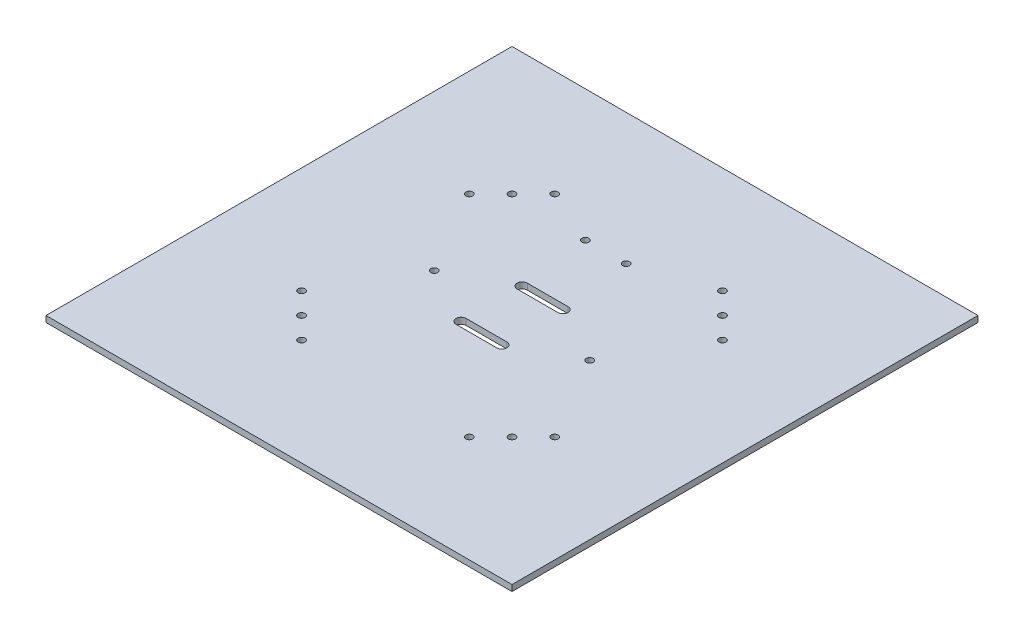
ISO-10303-21;
HEADER;
FILE_DESCRIPTION(('STEP AP214'),'2;1');
FILE_NAME('part.step','',(''),(''),'','','');
FILE_SCHEMA(('AUTOMOTIVE_DESIGN { 1 0 10303 214 1 1 1 1 }'));
ENDSEC;
DATA;
#1=APPLICATION_CONTEXT('core data for automotive mechanical design processes');
#2=APPLICATION_PROTOCOL_DEFINITION('international standard','automotive_design',2000,#1);
#3=PRODUCT_CONTEXT('',#1,'mechanical');
#4=PRODUCT('Part','Part','',(#3));
#5=PRODUCT_RELATED_PRODUCT_CATEGORY('part','',(#4));
#6=PRODUCT_DEFINITION_FORMATION('','',#4);
#7=PRODUCT_DEFINITION_CONTEXT('part definition',#1,'design');
#8=PRODUCT_DEFINITION('design','',#6,#7);
#9=PRODUCT_DEFINITION_SHAPE('','',#8);
#10=(LENGTH_UNIT() NAMED_UNIT(*) SI_UNIT(.MILLI.,.METRE.));
#11=(NAMED_UNIT(*) PLANE_ANGLE_UNIT() SI_UNIT($,.RADIAN.));
#12=(NAMED_UNIT(*) SI_UNIT($,.STERADIAN.) SOLID_ANGLE_UNIT());
#13=UNCERTAINTY_MEASURE_WITH_UNIT(LENGTH_MEASURE(1.E-05),#10,'distance_accuracy_value','');
#14=(GEOMETRIC_REPRESENTATION_CONTEXT(3) GLOBAL_UNCERTAINTY_ASSIGNED_CONTEXT((#13)) GLOBAL_UNIT_ASSIGNED_CONTEXT((#10,
#11,#12)) REPRESENTATION_CONTEXT('',''));
#15=CARTESIAN_POINT('',(0.,0.,0.));
#16=DIRECTION('',(0.,0.,1.));
#17=DIRECTION('',(1.,0.,0.));
#18=AXIS2_PLACEMENT_3D('',#15,#16,#17);
#19=CARTESIAN_POINT('',(114.3,3.,-114.3));
#20=DIRECTION('',(-1.,0.,0.));
#21=DIRECTION('',(0.,0.,1.));
#22=AXIS2_PLACEMENT_3D('',#19,#20,#21);
#23=PLANE('',#22);
#24=DIRECTION('',(0.,0.,-1.));
#25=VECTOR('',#24,1.);
#26=CARTESIAN_POINT('',(114.3,0.,-114.3));
#27=LINE('',#26,#25);
#28=CARTESIAN_POINT('',(114.3,0.,114.3));
#29=VERTEX_POINT('',#28);
#30=CARTESIAN_POINT('',(114.3,0.,-114.3));
#31=VERTEX_POINT('',#30);
#32=EDGE_CURVE('E283',#29,#31,#27,.T.);
#33=ORIENTED_EDGE('',*,*,#32,.T.);
#34=DIRECTION('',(0.,-1.,0.));
#35=VECTOR('',#34,1.);
#36=CARTESIAN_POINT('',(114.3,3.,-114.3));
#37=LINE('',#36,#35);
#38=CARTESIAN_POINT('',(114.3,3.,-114.3));
#39=VERTEX_POINT('',#38);
#40=EDGE_CURVE('E11',#39,#31,#37,.T.);
#41=ORIENTED_EDGE('',*,*,#40,.F.);
#42=DIRECTION('',(0.,0.,-1.));
#43=VECTOR('',#42,1.);
#44=CARTESIAN_POINT('',(114.3,3.,-114.3));
#45=LINE('',#44,#43);
#46=CARTESIAN_POINT('',(114.3,3.,114.3));
#47=VERTEX_POINT('',#46);
#48=EDGE_CURVE('E286',#47,#39,#45,.T.);
#49=ORIENTED_EDGE('',*,*,#48,.F.);
#50=DIRECTION('',(0.,-1.,0.));
#51=VECTOR('',#50,1.);
#52=CARTESIAN_POINT('',(114.3,3.,114.3));
#53=LINE('',#52,#51);
#54=EDGE_CURVE('E296',#47,#29,#53,.T.);
#55=ORIENTED_EDGE('',*,*,#54,.T.);
#56=EDGE_LOOP('',(#33,#41,#49,#55));
#57=FACE_BOUND('',#56,.T.);
#58=ADVANCED_FACE('F33',(#57),#23,.F.);
#59=CARTESIAN_POINT('',(-114.3,3.,-114.3));
#60=DIRECTION('',(0.,0.,1.));
#61=DIRECTION('',(1.,0.,0.));
#62=AXIS2_PLACEMENT_3D('',#59,#60,#61);
#63=PLANE('',#62);
#64=DIRECTION('',(-1.,0.,0.));
#65=VECTOR('',#64,1.);
#66=CARTESIAN_POINT('',(-114.3,0.,-114.3));
#67=LINE('',#66,#65);
#68=CARTESIAN_POINT('',(-114.3,0.,-114.3));
#69=VERTEX_POINT('',#68);
#70=EDGE_CURVE('E299',#31,#69,#67,.T.);
#71=ORIENTED_EDGE('',*,*,#70,.T.);
#72=DIRECTION('',(0.,-1.,0.));
#73=VECTOR('',#72,1.);
#74=CARTESIAN_POINT('',(-114.3,3.,-114.3));
#75=LINE('',#74,#73);
#76=CARTESIAN_POINT('',(-114.3,3.,-114.3));
#77=VERTEX_POINT('',#76);
#78=EDGE_CURVE('E40',#77,#69,#75,.T.);
#79=ORIENTED_EDGE('',*,*,#78,.F.);
#80=DIRECTION('',(-1.,0.,0.));
#81=VECTOR('',#80,1.);
#82=CARTESIAN_POINT('',(-114.3,3.,-114.3));
#83=LINE('',#82,#81);
#84=EDGE_CURVE('E289',#39,#77,#83,.T.);
#85=ORIENTED_EDGE('',*,*,#84,.F.);
#86=ORIENTED_EDGE('',*,*,#40,.T.);
#87=EDGE_LOOP('',(#71,#79,#85,#86));
#88=FACE_BOUND('',#87,.T.);
#89=ADVANCED_FACE('F328',(#88),#63,.F.);
#90=CARTESIAN_POINT('',(-114.3,3.,-114.3));
#91=DIRECTION('',(1.,0.,0.));
#92=DIRECTION('',(0.,0.,-1.));
#93=AXIS2_PLACEMENT_3D('',#90,#91,#92);
#94=PLANE('',#93);
#95=DIRECTION('',(0.,0.,1.));
#96=VECTOR('',#95,1.);
#97=CARTESIAN_POINT('',(-114.3,0.,-114.3));
#98=LINE('',#97,#96);
#99=CARTESIAN_POINT('',(-114.3,0.,114.3));
#100=VERTEX_POINT('',#99);
#101=EDGE_CURVE('E301',#69,#100,#98,.T.);
#102=ORIENTED_EDGE('',*,*,#101,.T.);
#103=DIRECTION('',(0.,-1.,0.));
#104=VECTOR('',#103,1.);
#105=CARTESIAN_POINT('',(-114.3,3.,114.3));
#106=LINE('',#105,#104);
#107=CARTESIAN_POINT('',(-114.3,3.,114.3));
#108=VERTEX_POINT('',#107);
#109=EDGE_CURVE('E306',#108,#100,#106,.T.);
#110=ORIENTED_EDGE('',*,*,#109,.F.);
#111=DIRECTION('',(0.,0.,1.));
#112=VECTOR('',#111,1.);
#113=CARTESIAN_POINT('',(-114.3,3.,-114.3));
#114=LINE('',#113,#112);
#115=EDGE_CURVE('E292',#77,#108,#114,.T.);
#116=ORIENTED_EDGE('',*,*,#115,.F.);
#117=ORIENTED_EDGE('',*,*,#78,.T.);
#118=EDGE_LOOP('',(#102,#110,#116,#117));
#119=FACE_BOUND('',#118,.T.);
#120=ADVANCED_FACE('F313',(#119),#94,.F.);
#121=CARTESIAN_POINT('',(-114.3,3.,114.3));
#122=DIRECTION('',(0.,0.,-1.));
#123=DIRECTION('',(-1.,0.,0.));
#124=AXIS2_PLACEMENT_3D('',#121,#122,#123);
#125=PLANE('',#124);
#126=DIRECTION('',(1.,0.,0.));
#127=VECTOR('',#126,1.);
#128=CARTESIAN_POINT('',(-114.3,0.,114.3));
#129=LINE('',#128,#127);
#130=EDGE_CURVE('E290',#100,#29,#129,.T.);
#131=ORIENTED_EDGE('',*,*,#130,.T.);
#132=ORIENTED_EDGE('',*,*,#54,.F.);
#133=DIRECTION('',(1.,0.,0.));
#134=VECTOR('',#133,1.);
#135=CARTESIAN_POINT('',(-114.3,3.,114.3));
#136=LINE('',#135,#134);
#137=EDGE_CURVE('E294',#108,#47,#136,.T.);
#138=ORIENTED_EDGE('',*,*,#137,.F.);
#139=ORIENTED_EDGE('',*,*,#109,.T.);
#140=EDGE_LOOP('',(#131,#132,#138,#139));
#141=FACE_BOUND('',#140,.T.);
#142=ADVANCED_FACE('F321',(#141),#125,.F.);
#143=CARTESIAN_POINT('',(0.,3.,0.));
#144=DIRECTION('',(0.,1.,0.));
#145=DIRECTION('',(0.,0.,1.));
#146=AXIS2_PLACEMENT_3D('',#143,#144,#145);
#147=PLANE('',#146);
#148=CARTESIAN_POINT('',(-9.99999999999999,3.,-15.));
#149=DIRECTION('',(0.,1.,0.));
#150=DIRECTION('',(0.,0.,1.));
#151=AXIS2_PLACEMENT_3D('',#148,#149,#150);
#152=CIRCLE('',#151,2.5);
#153=CARTESIAN_POINT('',(-9.99999999999999,3.,-17.5));
#154=VERTEX_POINT('',#153);
#155=CARTESIAN_POINT('',(-9.99999999999999,3.,-12.5));
#156=VERTEX_POINT('',#155);
#157=EDGE_CURVE('E47',#154,#156,#152,.T.);
#158=ORIENTED_EDGE('',*,*,#157,.F.);
#159=DIRECTION('',(-1.,0.,0.));
#160=VECTOR('',#159,1.);
#161=CARTESIAN_POINT('',(-9.99999999999999,3.,-17.5));
#162=LINE('',#161,#160);
#163=CARTESIAN_POINT('',(10.,3.,-17.5));
#164=VERTEX_POINT('',#163);
#165=EDGE_CURVE('E129',#164,#154,#162,.T.);
#166=ORIENTED_EDGE('',*,*,#165,.F.);
#167=CARTESIAN_POINT('',(10.,3.,-15.));
#168=DIRECTION('',(0.,1.,0.));
#169=DIRECTION('',(0.,0.,1.));
#170=AXIS2_PLACEMENT_3D('',#167,#168,#169);
#171=CIRCLE('',#170,2.5);
#172=CARTESIAN_POINT('',(10.,3.,-12.5));
#173=VERTEX_POINT('',#172);
#174=EDGE_CURVE('E152',#173,#164,#171,.T.);
#175=ORIENTED_EDGE('',*,*,#174,.F.);
#176=DIRECTION('',(1.,0.,0.));
#177=VECTOR('',#176,1.);
#178=CARTESIAN_POINT('',(-9.99999999999999,3.,-12.5));
#179=LINE('',#178,#177);
#180=EDGE_CURVE('E145',#156,#173,#179,.T.);
#181=ORIENTED_EDGE('',*,*,#180,.F.);
#182=EDGE_LOOP('',(#158,#166,#175,#181));
#183=FACE_BOUND('',#182,.T.);
#184=CARTESIAN_POINT('',(-10.,3.,15.));
#185=DIRECTION('',(0.,1.,0.));
#186=DIRECTION('',(0.,0.,1.));
#187=AXIS2_PLACEMENT_3D('',#184,#185,#186);
#188=CIRCLE('',#187,2.5);
#189=CARTESIAN_POINT('',(-9.99999999999998,3.,12.5));
#190=VERTEX_POINT('',#189);
#191=CARTESIAN_POINT('',(-9.99999999999998,3.,17.5));
#192=VERTEX_POINT('',#191);
#193=EDGE_CURVE('E55',#190,#192,#188,.T.);
#194=ORIENTED_EDGE('',*,*,#193,.F.);
#195=DIRECTION('',(-1.,0.,0.));
#196=VECTOR('',#195,1.);
#197=CARTESIAN_POINT('',(-9.99999999999998,3.,12.5));
#198=LINE('',#197,#196);
#199=CARTESIAN_POINT('',(10.,3.,12.5));
#200=VERTEX_POINT('',#199);
#201=EDGE_CURVE('E176',#200,#190,#198,.T.);
#202=ORIENTED_EDGE('',*,*,#201,.F.);
#203=CARTESIAN_POINT('',(10.,3.,15.));
#204=DIRECTION('',(0.,1.,0.));
#205=DIRECTION('',(0.,0.,1.));
#206=AXIS2_PLACEMENT_3D('',#203,#204,#205);
#207=CIRCLE('',#206,2.5);
#208=CARTESIAN_POINT('',(10.,3.,17.5));
#209=VERTEX_POINT('',#208);
#210=EDGE_CURVE('E173',#209,#200,#207,.T.);
#211=ORIENTED_EDGE('',*,*,#210,.F.);
#212=DIRECTION('',(1.,0.,0.));
#213=VECTOR('',#212,1.);
#214=CARTESIAN_POINT('',(-9.99999999999998,3.,17.5));
#215=LINE('',#214,#213);
#216=EDGE_CURVE('E170',#192,#209,#215,.T.);
#217=ORIENTED_EDGE('',*,*,#216,.F.);
#218=EDGE_LOOP('',(#194,#202,#211,#217));
#219=FACE_BOUND('',#218,.T.);
#220=CARTESIAN_POINT('',(-14.,3.,-50.));
#221=DIRECTION('',(0.,1.,0.));
#222=DIRECTION('',(0.,0.,1.));
#223=AXIS2_PLACEMENT_3D('',#220,#221,#222);
#224=CIRCLE('',#223,1.7);
#225=CARTESIAN_POINT('',(-14.,3.,-48.3));
#226=VERTEX_POINT('',#225);
#227=EDGE_CURVE('E190',#226,#226,#224,.T.);
#228=ORIENTED_EDGE('',*,*,#227,.F.);
#229=EDGE_LOOP('',(#228));
#230=FACE_BOUND('',#229,.T.);
#231=CARTESIAN_POINT('',(5.99999999999998,3.,-50.));
#232=DIRECTION('',(0.,1.,0.));
#233=DIRECTION('',(0.,0.,1.));
#234=AXIS2_PLACEMENT_3D('',#231,#232,#233);
#235=CIRCLE('',#234,1.7);
#236=CARTESIAN_POINT('',(5.99999999999998,3.,-48.3));
#237=VERTEX_POINT('',#236);
#238=EDGE_CURVE('E137',#237,#237,#235,.T.);
#239=ORIENTED_EDGE('',*,*,#238,.F.);
#240=EDGE_LOOP('',(#239));
#241=FACE_BOUND('',#240,.T.);
#242=CARTESIAN_POINT('',(-38.13,3.,0.));
#243=DIRECTION('',(0.,1.,0.));
#244=DIRECTION('',(0.,0.,1.));
#245=AXIS2_PLACEMENT_3D('',#242,#243,#244);
#246=CIRCLE('',#245,1.7);
#247=CARTESIAN_POINT('',(-38.13,3.,1.7));
#248=VERTEX_POINT('',#247);
#249=EDGE_CURVE('E206',#248,#248,#246,.T.);
#250=ORIENTED_EDGE('',*,*,#249,.F.);
#251=EDGE_LOOP('',(#250));
#252=FACE_BOUND('',#251,.T.);
#253=CARTESIAN_POINT('',(38.13,3.,0.));
#254=DIRECTION('',(0.,1.,0.));
#255=DIRECTION('',(0.,0.,1.));
#256=AXIS2_PLACEMENT_3D('',#253,#254,#255);
#257=CIRCLE('',#256,1.7);
#258=CARTESIAN_POINT('',(38.13,3.,1.7));
#259=VERTEX_POINT('',#258);
#260=EDGE_CURVE('E197',#259,#259,#257,.T.);
#261=ORIENTED_EDGE('',*,*,#260,.F.);
#262=EDGE_LOOP('',(#261));
#263=FACE_BOUND('',#262,.T.);
#264=CARTESIAN_POINT('',(62.0839753881918,3.,41.153614665057));
#265=DIRECTION('',(0.,1.,0.));
#266=DIRECTION('',(0.,0.,1.));
#267=AXIS2_PLACEMENT_3D('',#264,#265,#266);
#268=CIRCLE('',#267,1.6999999999964);
#269=CARTESIAN_POINT('',(62.0839753881918,3.,42.8536146650534));
#270=VERTEX_POINT('',#269);
#271=EDGE_CURVE('E248',#270,#270,#268,.T.);
#272=ORIENTED_EDGE('',*,*,#271,.F.);
#273=EDGE_LOOP('',(#272));
#274=FACE_BOUND('',#273,.T.);
#275=CARTESIAN_POINT('',(-51.6187950266051,3.,51.6187950266308));
#276=DIRECTION('',(0.,1.,0.));
#277=DIRECTION('',(0.,0.,1.));
#278=AXIS2_PLACEMENT_3D('',#275,#276,#277);
#279=CIRCLE('',#278,1.70000000000878);
#280=CARTESIAN_POINT('',(-51.6187950266051,3.,53.3187950266396));
#281=VERTEX_POINT('',#280);
#282=EDGE_CURVE('E235',#281,#281,#279,.T.);
#283=ORIENTED_EDGE('',*,*,#282,.F.);
#284=EDGE_LOOP('',(#283));
#285=FACE_BOUND('',#284,.T.);
#286=CARTESIAN_POINT('',(-62.083975388166,3.,41.15361466507));
#287=DIRECTION('',(0.,1.,0.));
#288=DIRECTION('',(0.,0.,1.));
#289=AXIS2_PLACEMENT_3D('',#286,#287,#288);
#290=CIRCLE('',#289,1.70000000000869);
#291=CARTESIAN_POINT('',(-62.083975388166,3.,42.8536146650786));
#292=VERTEX_POINT('',#291);
#293=EDGE_CURVE('E236',#292,#292,#290,.T.);
#294=ORIENTED_EDGE('',*,*,#293,.F.);
#295=EDGE_LOOP('',(#294));
#296=FACE_BOUND('',#295,.T.);
#297=CARTESIAN_POINT('',(-41.1536146650442,3.,62.0839753881918));
#298=DIRECTION('',(0.,1.,0.));
#299=DIRECTION('',(0.,0.,1.));
#300=AXIS2_PLACEMENT_3D('',#297,#298,#299);
#301=CIRCLE('',#300,1.70000000000886);
#302=CARTESIAN_POINT('',(-41.1536146650442,3.,63.7839753882006));
#303=VERTEX_POINT('',#302);
#304=EDGE_CURVE('E217',#303,#303,#301,.T.);
#305=ORIENTED_EDGE('',*,*,#304,.F.);
#306=EDGE_LOOP('',(#305));
#307=FACE_BOUND('',#306,.T.);
#308=CARTESIAN_POINT('',(41.15361466507,3.,62.0839753881789));
#309=DIRECTION('',(0.,1.,0.));
#310=DIRECTION('',(0.,0.,1.));
#311=AXIS2_PLACEMENT_3D('',#308,#309,#310);
#312=CIRCLE('',#311,1.69999999999631);
#313=CARTESIAN_POINT('',(41.15361466507,3.,63.7839753881752));
#314=VERTEX_POINT('',#313);
#315=EDGE_CURVE('E247',#314,#314,#312,.T.);
#316=ORIENTED_EDGE('',*,*,#315,.F.);
#317=EDGE_LOOP('',(#316));
#318=FACE_BOUND('',#317,.T.);
#319=CARTESIAN_POINT('',(51.6187950266309,3.,51.618795026618));
#320=DIRECTION('',(0.,1.,0.));
#321=DIRECTION('',(0.,0.,1.));
#322=AXIS2_PLACEMENT_3D('',#319,#320,#321);
#323=CIRCLE('',#322,1.69999999999636);
#324=CARTESIAN_POINT('',(51.6187950266309,3.,53.3187950266143));
#325=VERTEX_POINT('',#324);
#326=EDGE_CURVE('E272',#325,#325,#323,.T.);
#327=ORIENTED_EDGE('',*,*,#326,.F.);
#328=EDGE_LOOP('',(#327));
#329=FACE_BOUND('',#328,.T.);
#330=CARTESIAN_POINT('',(41.153614665057,3.,-62.0839753881789));
#331=DIRECTION('',(0.,1.,0.));
#332=DIRECTION('',(0.,0.,1.));
#333=AXIS2_PLACEMENT_3D('',#330,#331,#332);
#334=CIRCLE('',#333,1.7);
#335=CARTESIAN_POINT('',(41.153614665057,3.,-60.3839753881789));
#336=VERTEX_POINT('',#335);
#337=EDGE_CURVE('E266',#336,#336,#334,.T.);
#338=ORIENTED_EDGE('',*,*,#337,.F.);
#339=EDGE_LOOP('',(#338));
#340=FACE_BOUND('',#339,.T.);
#341=CARTESIAN_POINT('',(62.0839753881788,3.,-41.1536146650571));
#342=DIRECTION('',(0.,1.,0.));
#343=DIRECTION('',(0.,0.,1.));
#344=AXIS2_PLACEMENT_3D('',#341,#342,#343);
#345=CIRCLE('',#344,1.70000000000001);
#346=CARTESIAN_POINT('',(62.0839753881788,3.,-39.4536146650571));
#347=VERTEX_POINT('',#346);
#348=EDGE_CURVE('E260',#347,#347,#345,.T.);
#349=ORIENTED_EDGE('',*,*,#348,.F.);
#350=EDGE_LOOP('',(#349));
#351=FACE_BOUND('',#350,.T.);
#352=CARTESIAN_POINT('',(-51.618795026618,3.,-51.6187950266051));
#353=DIRECTION('',(0.,1.,0.));
#354=DIRECTION('',(0.,0.,1.));
#355=AXIS2_PLACEMENT_3D('',#352,#353,#354);
#356=CIRCLE('',#355,1.70000000001266);
#357=CARTESIAN_POINT('',(-51.618795026618,3.,-49.9187950265924));
#358=VERTEX_POINT('',#357);
#359=EDGE_CURVE('E218',#358,#358,#356,.T.);
#360=ORIENTED_EDGE('',*,*,#359,.F.);
#361=EDGE_LOOP('',(#360));
#362=FACE_BOUND('',#361,.T.);
#363=CARTESIAN_POINT('',(-41.1536146650571,3.,-62.083975388166));
#364=DIRECTION('',(0.,1.,0.));
#365=DIRECTION('',(0.,0.,1.));
#366=AXIS2_PLACEMENT_3D('',#363,#364,#365);
#367=CIRCLE('',#366,1.70000000001251);
#368=CARTESIAN_POINT('',(-41.1536146650571,3.,-60.3839753881535));
#369=VERTEX_POINT('',#368);
#370=EDGE_CURVE('E224',#369,#369,#367,.T.);
#371=ORIENTED_EDGE('',*,*,#370,.F.);
#372=EDGE_LOOP('',(#371));
#373=FACE_BOUND('',#372,.T.);
#374=CARTESIAN_POINT('',(-62.0839753881789,3.,-41.1536146650442));
#375=DIRECTION('',(0.,1.,0.));
#376=DIRECTION('',(0.,0.,1.));
#377=AXIS2_PLACEMENT_3D('',#374,#375,#376);
#378=CIRCLE('',#377,1.70000000001279);
#379=CARTESIAN_POINT('',(-62.0839753881789,3.,-39.4536146650314));
#380=VERTEX_POINT('',#379);
#381=EDGE_CURVE('E205',#380,#380,#378,.T.);
#382=ORIENTED_EDGE('',*,*,#381,.F.);
#383=EDGE_LOOP('',(#382));
#384=FACE_BOUND('',#383,.T.);
#385=CARTESIAN_POINT('',(51.618795026618,3.,-51.618795026618));
#386=DIRECTION('',(0.,1.,0.));
#387=DIRECTION('',(0.,0.,1.));
#388=AXIS2_PLACEMENT_3D('',#385,#386,#387);
#389=CIRCLE('',#388,1.7);
#390=CARTESIAN_POINT('',(51.618795026618,3.,-49.918795026618));
#391=VERTEX_POINT('',#390);
#392=EDGE_CURVE('E259',#391,#391,#389,.T.);
#393=ORIENTED_EDGE('',*,*,#392,.F.);
#394=EDGE_LOOP('',(#393));
#395=FACE_BOUND('',#394,.T.);
#396=ORIENTED_EDGE('',*,*,#48,.T.);
#397=ORIENTED_EDGE('',*,*,#84,.T.);
#398=ORIENTED_EDGE('',*,*,#115,.T.);
#399=ORIENTED_EDGE('',*,*,#137,.T.);
#400=EDGE_LOOP('',(#396,#397,#398,#399));
#401=FACE_BOUND('',#400,.T.);
#402=ADVANCED_FACE('F327',(#183,#219,#230,#241,#252,#263,#274,#285,#296,#307,#318,#329,#340,
#351,#362,#373,#384,#395,#401),#147,.T.);
#403=CARTESIAN_POINT('',(0.,0.,0.));
#404=DIRECTION('',(0.,1.,0.));
#405=DIRECTION('',(0.,0.,1.));
#406=AXIS2_PLACEMENT_3D('',#403,#404,#405);
#407=PLANE('',#406);
#408=DIRECTION('',(1.,0.,0.));
#409=VECTOR('',#408,1.);
#410=CARTESIAN_POINT('',(-9.99999999999999,0.,-17.5));
#411=LINE('',#410,#409);
#412=CARTESIAN_POINT('',(-9.99999999999999,0.,-17.5));
#413=VERTEX_POINT('',#412);
#414=CARTESIAN_POINT('',(10.,0.,-17.5));
#415=VERTEX_POINT('',#414);
#416=EDGE_CURVE('E143',#413,#415,#411,.T.);
#417=ORIENTED_EDGE('',*,*,#416,.F.);
#418=CARTESIAN_POINT('',(-9.99999999999999,0.,-15.));
#419=DIRECTION('',(0.,1.,0.));
#420=DIRECTION('',(0.,0.,1.));
#421=AXIS2_PLACEMENT_3D('',#418,#419,#420);
#422=CIRCLE('',#421,2.5);
#423=CARTESIAN_POINT('',(-9.99999999999999,0.,-12.5));
#424=VERTEX_POINT('',#423);
#425=EDGE_CURVE('E123',#424,#413,#422,.F.);
#426=ORIENTED_EDGE('',*,*,#425,.F.);
#427=DIRECTION('',(-1.,0.,0.));
#428=VECTOR('',#427,1.);
#429=CARTESIAN_POINT('',(-9.99999999999999,0.,-12.5));
#430=LINE('',#429,#428);
#431=CARTESIAN_POINT('',(10.,0.,-12.5));
#432=VERTEX_POINT('',#431);
#433=EDGE_CURVE('E133',#432,#424,#430,.T.);
#434=ORIENTED_EDGE('',*,*,#433,.F.);
#435=CARTESIAN_POINT('',(10.,0.,-15.));
#436=DIRECTION('',(0.,1.,0.));
#437=DIRECTION('',(0.,0.,1.));
#438=AXIS2_PLACEMENT_3D('',#435,#436,#437);
#439=CIRCLE('',#438,2.5);
#440=EDGE_CURVE('E147',#415,#432,#439,.F.);
#441=ORIENTED_EDGE('',*,*,#440,.F.);
#442=EDGE_LOOP('',(#417,#426,#434,#441));
#443=FACE_BOUND('',#442,.T.);
#444=DIRECTION('',(1.,0.,0.));
#445=VECTOR('',#444,1.);
#446=CARTESIAN_POINT('',(-9.99999999999998,0.,12.5));
#447=LINE('',#446,#445);
#448=CARTESIAN_POINT('',(-9.99999999999998,0.,12.5));
#449=VERTEX_POINT('',#448);
#450=CARTESIAN_POINT('',(10.,0.,12.5));
#451=VERTEX_POINT('',#450);
#452=EDGE_CURVE('E163',#449,#451,#447,.T.);
#453=ORIENTED_EDGE('',*,*,#452,.F.);
#454=CARTESIAN_POINT('',(-10.,0.,15.));
#455=DIRECTION('',(0.,1.,0.));
#456=DIRECTION('',(0.,0.,1.));
#457=AXIS2_PLACEMENT_3D('',#454,#455,#456);
#458=CIRCLE('',#457,2.5);
#459=CARTESIAN_POINT('',(-9.99999999999998,0.,17.5));
#460=VERTEX_POINT('',#459);
#461=EDGE_CURVE('E166',#460,#449,#458,.F.);
#462=ORIENTED_EDGE('',*,*,#461,.F.);
#463=DIRECTION('',(-1.,0.,0.));
#464=VECTOR('',#463,1.);
#465=CARTESIAN_POINT('',(-9.99999999999998,0.,17.5));
#466=LINE('',#465,#464);
#467=CARTESIAN_POINT('',(10.,0.,17.5));
#468=VERTEX_POINT('',#467);
#469=EDGE_CURVE('E182',#468,#460,#466,.T.);
#470=ORIENTED_EDGE('',*,*,#469,.F.);
#471=CARTESIAN_POINT('',(10.,0.,15.));
#472=DIRECTION('',(0.,1.,0.));
#473=DIRECTION('',(0.,0.,1.));
#474=AXIS2_PLACEMENT_3D('',#471,#472,#473);
#475=CIRCLE('',#474,2.5);
#476=EDGE_CURVE('E161',#451,#468,#475,.F.);
#477=ORIENTED_EDGE('',*,*,#476,.F.);
#478=EDGE_LOOP('',(#453,#462,#470,#477));
#479=FACE_BOUND('',#478,.T.);
#480=CARTESIAN_POINT('',(-14.,0.,-50.));
#481=DIRECTION('',(0.,1.,0.));
#482=DIRECTION('',(0.,0.,1.));
#483=AXIS2_PLACEMENT_3D('',#480,#481,#482);
#484=CIRCLE('',#483,1.7);
#485=CARTESIAN_POINT('',(-14.,0.,-48.3));
#486=VERTEX_POINT('',#485);
#487=EDGE_CURVE('E193',#486,#486,#484,.F.);
#488=ORIENTED_EDGE('',*,*,#487,.F.);
#489=EDGE_LOOP('',(#488));
#490=FACE_BOUND('',#489,.T.);
#491=CARTESIAN_POINT('',(5.99999999999998,0.,-50.));
#492=DIRECTION('',(0.,1.,0.));
#493=DIRECTION('',(0.,0.,1.));
#494=AXIS2_PLACEMENT_3D('',#491,#492,#493);
#495=CIRCLE('',#494,1.7);
#496=CARTESIAN_POINT('',(5.99999999999998,0.,-48.3));
#497=VERTEX_POINT('',#496);
#498=EDGE_CURVE('E194',#497,#497,#495,.F.);
#499=ORIENTED_EDGE('',*,*,#498,.F.);
#500=EDGE_LOOP('',(#499));
#501=FACE_BOUND('',#500,.T.);
#502=CARTESIAN_POINT('',(-38.13,0.,0.));
#503=DIRECTION('',(0.,1.,0.));
#504=DIRECTION('',(0.,0.,1.));
#505=AXIS2_PLACEMENT_3D('',#502,#503,#504);
#506=CIRCLE('',#505,1.7);
#507=CARTESIAN_POINT('',(-38.13,0.,1.7));
#508=VERTEX_POINT('',#507);
#509=EDGE_CURVE('E202',#508,#508,#506,.T.);
#510=ORIENTED_EDGE('',*,*,#509,.T.);
#511=EDGE_LOOP('',(#510));
#512=FACE_BOUND('',#511,.T.);
#513=CARTESIAN_POINT('',(38.13,0.,0.));
#514=DIRECTION('',(0.,1.,0.));
#515=DIRECTION('',(0.,0.,1.));
#516=AXIS2_PLACEMENT_3D('',#513,#514,#515);
#517=CIRCLE('',#516,1.7);
#518=CARTESIAN_POINT('',(38.13,0.,1.7));
#519=VERTEX_POINT('',#518);
#520=EDGE_CURVE('E209',#519,#519,#517,.T.);
#521=ORIENTED_EDGE('',*,*,#520,.T.);
#522=EDGE_LOOP('',(#521));
#523=FACE_BOUND('',#522,.T.);
#524=CARTESIAN_POINT('',(62.0839753881918,0.,41.153614665057));
#525=DIRECTION('',(0.,1.,0.));
#526=DIRECTION('',(0.,0.,1.));
#527=AXIS2_PLACEMENT_3D('',#524,#525,#526);
#528=CIRCLE('',#527,1.6999999999964);
#529=CARTESIAN_POINT('',(62.0839753881918,0.,42.8536146650534));
#530=VERTEX_POINT('',#529);
#531=EDGE_CURVE('E244',#530,#530,#528,.T.);
#532=ORIENTED_EDGE('',*,*,#531,.T.);
#533=EDGE_LOOP('',(#532));
#534=FACE_BOUND('',#533,.T.);
#535=CARTESIAN_POINT('',(-51.6187950266051,0.,51.6187950266308));
#536=DIRECTION('',(0.,1.,0.));
#537=DIRECTION('',(0.,0.,1.));
#538=AXIS2_PLACEMENT_3D('',#535,#536,#537);
#539=CIRCLE('',#538,1.70000000000878);
#540=CARTESIAN_POINT('',(-51.6187950266051,0.,53.3187950266396));
#541=VERTEX_POINT('',#540);
#542=EDGE_CURVE('E251',#541,#541,#539,.T.);
#543=ORIENTED_EDGE('',*,*,#542,.T.);
#544=EDGE_LOOP('',(#543));
#545=FACE_BOUND('',#544,.T.);
#546=CARTESIAN_POINT('',(-62.083975388166,0.,41.15361466507));
#547=DIRECTION('',(0.,1.,0.));
#548=DIRECTION('',(0.,0.,1.));
#549=AXIS2_PLACEMENT_3D('',#546,#547,#548);
#550=CIRCLE('',#549,1.70000000000869);
#551=CARTESIAN_POINT('',(-62.083975388166,0.,42.8536146650786));
#552=VERTEX_POINT('',#551);
#553=EDGE_CURVE('E232',#552,#552,#550,.T.);
#554=ORIENTED_EDGE('',*,*,#553,.T.);
#555=EDGE_LOOP('',(#554));
#556=FACE_BOUND('',#555,.T.);
#557=CARTESIAN_POINT('',(-41.1536146650442,0.,62.0839753881918));
#558=DIRECTION('',(0.,1.,0.));
#559=DIRECTION('',(0.,0.,1.));
#560=AXIS2_PLACEMENT_3D('',#557,#558,#559);
#561=CIRCLE('',#560,1.70000000000886);
#562=CARTESIAN_POINT('',(-41.1536146650442,0.,63.7839753882006));
#563=VERTEX_POINT('',#562);
#564=EDGE_CURVE('E239',#563,#563,#561,.T.);
#565=ORIENTED_EDGE('',*,*,#564,.T.);
#566=EDGE_LOOP('',(#565));
#567=FACE_BOUND('',#566,.T.);
#568=CARTESIAN_POINT('',(41.15361466507,0.,62.0839753881789));
#569=DIRECTION('',(0.,1.,0.));
#570=DIRECTION('',(0.,0.,1.));
#571=AXIS2_PLACEMENT_3D('',#568,#569,#570);
#572=CIRCLE('',#571,1.69999999999631);
#573=CARTESIAN_POINT('',(41.15361466507,0.,63.7839753881752));
#574=VERTEX_POINT('',#573);
#575=EDGE_CURVE('E275',#574,#574,#572,.T.);
#576=ORIENTED_EDGE('',*,*,#575,.T.);
#577=EDGE_LOOP('',(#576));
#578=FACE_BOUND('',#577,.T.);
#579=CARTESIAN_POINT('',(51.6187950266309,0.,51.618795026618));
#580=DIRECTION('',(0.,1.,0.));
#581=DIRECTION('',(0.,0.,1.));
#582=AXIS2_PLACEMENT_3D('',#579,#580,#581);
#583=CIRCLE('',#582,1.69999999999636);
#584=CARTESIAN_POINT('',(51.6187950266309,0.,53.3187950266143));
#585=VERTEX_POINT('',#584);
#586=EDGE_CURVE('E269',#585,#585,#583,.T.);
#587=ORIENTED_EDGE('',*,*,#586,.T.);
#588=EDGE_LOOP('',(#587));
#589=FACE_BOUND('',#588,.T.);
#590=CARTESIAN_POINT('',(41.153614665057,0.,-62.0839753881789));
#591=DIRECTION('',(0.,1.,0.));
#592=DIRECTION('',(0.,0.,1.));
#593=AXIS2_PLACEMENT_3D('',#590,#591,#592);
#594=CIRCLE('',#593,1.7);
#595=CARTESIAN_POINT('',(41.153614665057,0.,-60.3839753881789));
#596=VERTEX_POINT('',#595);
#597=EDGE_CURVE('E263',#596,#596,#594,.T.);
#598=ORIENTED_EDGE('',*,*,#597,.T.);
#599=EDGE_LOOP('',(#598));
#600=FACE_BOUND('',#599,.T.);
#601=CARTESIAN_POINT('',(62.0839753881788,0.,-41.1536146650571));
#602=DIRECTION('',(0.,1.,0.));
#603=DIRECTION('',(0.,0.,1.));
#604=AXIS2_PLACEMENT_3D('',#601,#602,#603);
#605=CIRCLE('',#604,1.70000000000001);
#606=CARTESIAN_POINT('',(62.0839753881788,0.,-39.4536146650571));
#607=VERTEX_POINT('',#606);
#608=EDGE_CURVE('E256',#607,#607,#605,.T.);
#609=ORIENTED_EDGE('',*,*,#608,.T.);
#610=EDGE_LOOP('',(#609));
#611=FACE_BOUND('',#610,.T.);
#612=CARTESIAN_POINT('',(-51.618795026618,0.,-51.6187950266051));
#613=DIRECTION('',(0.,1.,0.));
#614=DIRECTION('',(0.,0.,1.));
#615=AXIS2_PLACEMENT_3D('',#612,#613,#614);
#616=CIRCLE('',#615,1.70000000001266);
#617=CARTESIAN_POINT('',(-51.618795026618,0.,-49.9187950265924));
#618=VERTEX_POINT('',#617);
#619=EDGE_CURVE('E214',#618,#618,#616,.T.);
#620=ORIENTED_EDGE('',*,*,#619,.T.);
#621=EDGE_LOOP('',(#620));
#622=FACE_BOUND('',#621,.T.);
#623=CARTESIAN_POINT('',(-41.1536146650571,0.,-62.083975388166));
#624=DIRECTION('',(0.,1.,0.));
#625=DIRECTION('',(0.,0.,1.));
#626=AXIS2_PLACEMENT_3D('',#623,#624,#625);
#627=CIRCLE('',#626,1.70000000001251);
#628=CARTESIAN_POINT('',(-41.1536146650571,0.,-60.3839753881535));
#629=VERTEX_POINT('',#628);
#630=EDGE_CURVE('E221',#629,#629,#627,.T.);
#631=ORIENTED_EDGE('',*,*,#630,.T.);
#632=EDGE_LOOP('',(#631));
#633=FACE_BOUND('',#632,.T.);
#634=CARTESIAN_POINT('',(-62.0839753881789,0.,-41.1536146650442));
#635=DIRECTION('',(0.,1.,0.));
#636=DIRECTION('',(0.,0.,1.));
#637=AXIS2_PLACEMENT_3D('',#634,#635,#636);
#638=CIRCLE('',#637,1.70000000001279);
#639=CARTESIAN_POINT('',(-62.0839753881789,0.,-39.4536146650314));
#640=VERTEX_POINT('',#639);
#641=EDGE_CURVE('E227',#640,#640,#638,.T.);
#642=ORIENTED_EDGE('',*,*,#641,.T.);
#643=EDGE_LOOP('',(#642));
#644=FACE_BOUND('',#643,.T.);
#645=CARTESIAN_POINT('',(51.618795026618,0.,-51.618795026618));
#646=DIRECTION('',(0.,1.,0.));
#647=DIRECTION('',(0.,0.,1.));
#648=AXIS2_PLACEMENT_3D('',#645,#646,#647);
#649=CIRCLE('',#648,1.7);
#650=CARTESIAN_POINT('',(51.618795026618,0.,-49.918795026618));
#651=VERTEX_POINT('',#650);
#652=EDGE_CURVE('E280',#651,#651,#649,.T.);
#653=ORIENTED_EDGE('',*,*,#652,.T.);
#654=EDGE_LOOP('',(#653));
#655=FACE_BOUND('',#654,.T.);
#656=ORIENTED_EDGE('',*,*,#32,.F.);
#657=ORIENTED_EDGE('',*,*,#130,.F.);
#658=ORIENTED_EDGE('',*,*,#101,.F.);
#659=ORIENTED_EDGE('',*,*,#70,.F.);
#660=EDGE_LOOP('',(#656,#657,#658,#659));
#661=FACE_BOUND('',#660,.T.);
#662=ADVANCED_FACE('F140',(#443,#479,#490,#501,#512,#523,#534,#545,#556,#567,#578,#589,#600,
#611,#622,#633,#644,#655,#661),#407,.F.);
#663=CARTESIAN_POINT('',(51.618795026618,0.,-51.618795026618));
#664=DIRECTION('',(0.,1.,0.));
#665=DIRECTION('',(0.,0.,1.));
#666=AXIS2_PLACEMENT_3D('',#663,#664,#665);
#667=CYLINDRICAL_SURFACE('',#666,1.7);
#668=ORIENTED_EDGE('',*,*,#652,.F.);
#669=EDGE_LOOP('',(#668));
#670=FACE_BOUND('',#669,.T.);
#671=ORIENTED_EDGE('',*,*,#392,.T.);
#672=EDGE_LOOP('',(#671));
#673=FACE_BOUND('',#672,.T.);
#674=ADVANCED_FACE('F340',(#670,#673),#667,.F.);
#675=CARTESIAN_POINT('',(-62.0839753881789,0.,-41.1536146650442));
#676=DIRECTION('',(0.,1.,0.));
#677=DIRECTION('',(0.,0.,1.));
#678=AXIS2_PLACEMENT_3D('',#675,#676,#677);
#679=CYLINDRICAL_SURFACE('',#678,1.70000000001279);
#680=ORIENTED_EDGE('',*,*,#641,.F.);
#681=EDGE_LOOP('',(#680));
#682=FACE_BOUND('',#681,.T.);
#683=ORIENTED_EDGE('',*,*,#381,.T.);
#684=EDGE_LOOP('',(#683));
#685=FACE_BOUND('',#684,.T.);
#686=ADVANCED_FACE('F346',(#682,#685),#679,.F.);
#687=CARTESIAN_POINT('',(-41.1536146650571,0.,-62.083975388166));
#688=DIRECTION('',(0.,1.,0.));
#689=DIRECTION('',(0.,0.,1.));
#690=AXIS2_PLACEMENT_3D('',#687,#688,#689);
#691=CYLINDRICAL_SURFACE('',#690,1.70000000001251);
#692=ORIENTED_EDGE('',*,*,#630,.F.);
#693=EDGE_LOOP('',(#692));
#694=FACE_BOUND('',#693,.T.);
#695=ORIENTED_EDGE('',*,*,#370,.T.);
#696=EDGE_LOOP('',(#695));
#697=FACE_BOUND('',#696,.T.);
#698=ADVANCED_FACE('F384',(#694,#697),#691,.F.);
#699=CARTESIAN_POINT('',(-51.618795026618,0.,-51.6187950266051));
#700=DIRECTION('',(0.,1.,0.));
#701=DIRECTION('',(0.,0.,1.));
#702=AXIS2_PLACEMENT_3D('',#699,#700,#701);
#703=CYLINDRICAL_SURFACE('',#702,1.70000000001266);
#704=ORIENTED_EDGE('',*,*,#619,.F.);
#705=EDGE_LOOP('',(#704));
#706=FACE_BOUND('',#705,.T.);
#707=ORIENTED_EDGE('',*,*,#359,.T.);
#708=EDGE_LOOP('',(#707));
#709=FACE_BOUND('',#708,.T.);
#710=ADVANCED_FACE('F364',(#706,#709),#703,.F.);
#711=CARTESIAN_POINT('',(62.0839753881788,0.,-41.1536146650571));
#712=DIRECTION('',(0.,1.,0.));
#713=DIRECTION('',(0.,0.,1.));
#714=AXIS2_PLACEMENT_3D('',#711,#712,#713);
#715=CYLINDRICAL_SURFACE('',#714,1.70000000000001);
#716=ORIENTED_EDGE('',*,*,#608,.F.);
#717=EDGE_LOOP('',(#716));
#718=FACE_BOUND('',#717,.T.);
#719=ORIENTED_EDGE('',*,*,#348,.T.);
#720=EDGE_LOOP('',(#719));
#721=FACE_BOUND('',#720,.T.);
#722=ADVANCED_FACE('F360',(#718,#721),#715,.F.);
#723=CARTESIAN_POINT('',(41.153614665057,0.,-62.0839753881789));
#724=DIRECTION('',(0.,1.,0.));
#725=DIRECTION('',(0.,0.,1.));
#726=AXIS2_PLACEMENT_3D('',#723,#724,#725);
#727=CYLINDRICAL_SURFACE('',#726,1.7);
#728=ORIENTED_EDGE('',*,*,#597,.F.);
#729=EDGE_LOOP('',(#728));
#730=FACE_BOUND('',#729,.T.);
#731=ORIENTED_EDGE('',*,*,#337,.T.);
#732=EDGE_LOOP('',(#731));
#733=FACE_BOUND('',#732,.T.);
#734=ADVANCED_FACE('F356',(#730,#733),#727,.F.);
#735=CARTESIAN_POINT('',(51.6187950266309,0.,51.618795026618));
#736=DIRECTION('',(0.,1.,0.));
#737=DIRECTION('',(0.,0.,1.));
#738=AXIS2_PLACEMENT_3D('',#735,#736,#737);
#739=CYLINDRICAL_SURFACE('',#738,1.69999999999636);
#740=ORIENTED_EDGE('',*,*,#586,.F.);
#741=EDGE_LOOP('',(#740));
#742=FACE_BOUND('',#741,.T.);
#743=ORIENTED_EDGE('',*,*,#326,.T.);
#744=EDGE_LOOP('',(#743));
#745=FACE_BOUND('',#744,.T.);
#746=ADVANCED_FACE('F352',(#742,#745),#739,.F.);
#747=CARTESIAN_POINT('',(41.15361466507,0.,62.0839753881789));
#748=DIRECTION('',(0.,1.,0.));
#749=DIRECTION('',(0.,0.,1.));
#750=AXIS2_PLACEMENT_3D('',#747,#748,#749);
#751=CYLINDRICAL_SURFACE('',#750,1.69999999999631);
#752=ORIENTED_EDGE('',*,*,#575,.F.);
#753=EDGE_LOOP('',(#752));
#754=FACE_BOUND('',#753,.T.);
#755=ORIENTED_EDGE('',*,*,#315,.T.);
#756=EDGE_LOOP('',(#755));
#757=FACE_BOUND('',#756,.T.);
#758=ADVANCED_FACE('F348',(#754,#757),#751,.F.);
#759=CARTESIAN_POINT('',(-41.1536146650442,0.,62.0839753881918));
#760=DIRECTION('',(0.,1.,0.));
#761=DIRECTION('',(0.,0.,1.));
#762=AXIS2_PLACEMENT_3D('',#759,#760,#761);
#763=CYLINDRICAL_SURFACE('',#762,1.70000000000886);
#764=ORIENTED_EDGE('',*,*,#564,.F.);
#765=EDGE_LOOP('',(#764));
#766=FACE_BOUND('',#765,.T.);
#767=ORIENTED_EDGE('',*,*,#304,.T.);
#768=EDGE_LOOP('',(#767));
#769=FACE_BOUND('',#768,.T.);
#770=ADVANCED_FACE('F351',(#766,#769),#763,.F.);
#771=CARTESIAN_POINT('',(-62.083975388166,0.,41.15361466507));
#772=DIRECTION('',(0.,1.,0.));
#773=DIRECTION('',(0.,0.,1.));
#774=AXIS2_PLACEMENT_3D('',#771,#772,#773);
#775=CYLINDRICAL_SURFACE('',#774,1.70000000000869);
#776=ORIENTED_EDGE('',*,*,#553,.F.);
#777=EDGE_LOOP('',(#776));
#778=FACE_BOUND('',#777,.T.);
#779=ORIENTED_EDGE('',*,*,#293,.T.);
#780=EDGE_LOOP('',(#779));
#781=FACE_BOUND('',#780,.T.);
#782=ADVANCED_FACE('F370',(#778,#781),#775,.F.);
#783=CARTESIAN_POINT('',(-51.6187950266051,0.,51.6187950266308));
#784=DIRECTION('',(0.,1.,0.));
#785=DIRECTION('',(0.,0.,1.));
#786=AXIS2_PLACEMENT_3D('',#783,#784,#785);
#787=CYLINDRICAL_SURFACE('',#786,1.70000000000878);
#788=ORIENTED_EDGE('',*,*,#542,.F.);
#789=EDGE_LOOP('',(#788));
#790=FACE_BOUND('',#789,.T.);
#791=ORIENTED_EDGE('',*,*,#282,.T.);
#792=EDGE_LOOP('',(#791));
#793=FACE_BOUND('',#792,.T.);
#794=ADVANCED_FACE('F366',(#790,#793),#787,.F.);
#795=CARTESIAN_POINT('',(62.0839753881918,0.,41.153614665057));
#796=DIRECTION('',(0.,1.,0.));
#797=DIRECTION('',(0.,0.,1.));
#798=AXIS2_PLACEMENT_3D('',#795,#796,#797);
#799=CYLINDRICAL_SURFACE('',#798,1.6999999999964);
#800=ORIENTED_EDGE('',*,*,#531,.F.);
#801=EDGE_LOOP('',(#800));
#802=FACE_BOUND('',#801,.T.);
#803=ORIENTED_EDGE('',*,*,#271,.T.);
#804=EDGE_LOOP('',(#803));
#805=FACE_BOUND('',#804,.T.);
#806=ADVANCED_FACE('F369',(#802,#805),#799,.F.);
#807=CARTESIAN_POINT('',(38.13,0.,0.));
#808=DIRECTION('',(0.,1.,0.));
#809=DIRECTION('',(0.,0.,1.));
#810=AXIS2_PLACEMENT_3D('',#807,#808,#809);
#811=CYLINDRICAL_SURFACE('',#810,1.7);
#812=ORIENTED_EDGE('',*,*,#520,.F.);
#813=EDGE_LOOP('',(#812));
#814=FACE_BOUND('',#813,.T.);
#815=ORIENTED_EDGE('',*,*,#260,.T.);
#816=EDGE_LOOP('',(#815));
#817=FACE_BOUND('',#816,.T.);
#818=ADVANCED_FACE('F374',(#814,#817),#811,.F.);
#819=CARTESIAN_POINT('',(-38.13,0.,0.));
#820=DIRECTION('',(0.,1.,0.));
#821=DIRECTION('',(0.,0.,1.));
#822=AXIS2_PLACEMENT_3D('',#819,#820,#821);
#823=CYLINDRICAL_SURFACE('',#822,1.7);
#824=ORIENTED_EDGE('',*,*,#509,.F.);
#825=EDGE_LOOP('',(#824));
#826=FACE_BOUND('',#825,.T.);
#827=ORIENTED_EDGE('',*,*,#249,.T.);
#828=EDGE_LOOP('',(#827));
#829=FACE_BOUND('',#828,.T.);
#830=ADVANCED_FACE('F394',(#826,#829),#823,.F.);
#831=CARTESIAN_POINT('',(5.99999999999998,-0.00100000000000013,-50.));
#832=DIRECTION('',(0.,1.,0.));
#833=DIRECTION('',(0.,0.,1.));
#834=AXIS2_PLACEMENT_3D('',#831,#832,#833);
#835=CYLINDRICAL_SURFACE('',#834,1.7);
#836=CARTESIAN_POINT('',(5.99999999999998,3.,-48.3));
#837=CARTESIAN_POINT('',(5.99999999999998,2.96875,-48.3));
#838=CARTESIAN_POINT('',(5.99999999999998,2.9375,-48.3));
#839=CARTESIAN_POINT('',(5.99999999999998,2.875,-48.3));
#840=CARTESIAN_POINT('',(5.99999999999998,2.84375,-48.3));
#841=CARTESIAN_POINT('',(5.99999999999998,2.78125,-48.3));
#842=CARTESIAN_POINT('',(5.99999999999998,2.75,-48.3));
#843=CARTESIAN_POINT('',(5.99999999999998,2.6875,-48.3));
#844=CARTESIAN_POINT('',(5.99999999999998,2.65625,-48.3));
#845=CARTESIAN_POINT('',(5.99999999999998,2.59375,-48.3));
#846=CARTESIAN_POINT('',(5.99999999999998,2.5625,-48.3));
#847=CARTESIAN_POINT('',(5.99999999999998,2.5,-48.3));
#848=CARTESIAN_POINT('',(5.99999999999998,2.46875,-48.3));
#849=CARTESIAN_POINT('',(5.99999999999998,2.40625,-48.3));
#850=CARTESIAN_POINT('',(5.99999999999998,2.375,-48.3));
#851=CARTESIAN_POINT('',(5.99999999999998,2.3125,-48.3));
#852=CARTESIAN_POINT('',(5.99999999999998,2.28125,-48.3));
#853=CARTESIAN_POINT('',(5.99999999999998,2.21875,-48.3));
#854=CARTESIAN_POINT('',(5.99999999999998,2.1875,-48.3));
#855=CARTESIAN_POINT('',(5.99999999999998,2.125,-48.3));
#856=CARTESIAN_POINT('',(5.99999999999998,2.09375,-48.3));
#857=CARTESIAN_POINT('',(5.99999999999998,2.03125,-48.3));
#858=CARTESIAN_POINT('',(5.99999999999998,2.,-48.3));
#859=CARTESIAN_POINT('',(5.99999999999998,1.9375,-48.3));
#860=CARTESIAN_POINT('',(5.99999999999998,1.90625,-48.3));
#861=CARTESIAN_POINT('',(5.99999999999998,1.84375,-48.3));
#862=CARTESIAN_POINT('',(5.99999999999998,1.8125,-48.3));
#863=CARTESIAN_POINT('',(5.99999999999998,1.75,-48.3));
#864=CARTESIAN_POINT('',(5.99999999999998,1.71875,-48.3));
#865=CARTESIAN_POINT('',(5.99999999999998,1.65625,-48.3));
#866=CARTESIAN_POINT('',(5.99999999999998,1.625,-48.3));
#867=CARTESIAN_POINT('',(5.99999999999998,1.5625,-48.3));
#868=CARTESIAN_POINT('',(5.99999999999998,1.53125,-48.3));
#869=CARTESIAN_POINT('',(5.99999999999998,1.46875,-48.3));
#870=CARTESIAN_POINT('',(5.99999999999998,1.4375,-48.3));
#871=CARTESIAN_POINT('',(5.99999999999998,1.375,-48.3));
#872=CARTESIAN_POINT('',(5.99999999999998,1.34375,-48.3));
#873=CARTESIAN_POINT('',(5.99999999999998,1.28125,-48.3));
#874=CARTESIAN_POINT('',(5.99999999999998,1.25,-48.3));
#875=CARTESIAN_POINT('',(5.99999999999998,1.1875,-48.3));
#876=CARTESIAN_POINT('',(5.99999999999998,1.15625,-48.3));
#877=CARTESIAN_POINT('',(5.99999999999998,1.09375,-48.3));
#878=CARTESIAN_POINT('',(5.99999999999998,1.0625,-48.3));
#879=CARTESIAN_POINT('',(5.99999999999998,1.,-48.3));
#880=CARTESIAN_POINT('',(5.99999999999998,0.96875,-48.3));
#881=CARTESIAN_POINT('',(5.99999999999998,0.90625,-48.3));
#882=CARTESIAN_POINT('',(5.99999999999998,0.875,-48.3));
#883=CARTESIAN_POINT('',(5.99999999999998,0.8125,-48.3));
#884=CARTESIAN_POINT('',(5.99999999999998,0.78125,-48.3));
#885=CARTESIAN_POINT('',(5.99999999999998,0.71875,-48.3));
#886=CARTESIAN_POINT('',(5.99999999999998,0.6875,-48.3));
#887=CARTESIAN_POINT('',(5.99999999999998,0.625,-48.3));
#888=CARTESIAN_POINT('',(5.99999999999998,0.59375,-48.3));
#889=CARTESIAN_POINT('',(5.99999999999998,0.53125,-48.3));
#890=CARTESIAN_POINT('',(5.99999999999998,0.5,-48.3));
#891=CARTESIAN_POINT('',(5.99999999999998,0.4375,-48.3));
#892=CARTESIAN_POINT('',(5.99999999999998,0.40625,-48.3));
#893=CARTESIAN_POINT('',(5.99999999999998,0.34375,-48.3));
#894=CARTESIAN_POINT('',(5.99999999999998,0.3125,-48.3));
#895=CARTESIAN_POINT('',(5.99999999999998,0.25,-48.3));
#896=CARTESIAN_POINT('',(5.99999999999998,0.21875,-48.3));
#897=CARTESIAN_POINT('',(5.99999999999998,0.15625,-48.3));
#898=CARTESIAN_POINT('',(5.99999999999998,0.125,-48.3));
#899=CARTESIAN_POINT('',(5.99999999999998,0.0625000000000001,-48.3));
#900=CARTESIAN_POINT('',(5.99999999999998,0.0312500000000001,-48.3));
#901=CARTESIAN_POINT('',(5.99999999999998,0.,-48.3));
#902=B_SPLINE_CURVE_WITH_KNOTS('',3,(#836,#837,#838,#839,#840,#841,#842,#843,#844,#845,#846,
#847,#848,#849,#850,#851,#852,#853,#854,#855,#856,#857,#858,#859,#860,#861,#862,#863,#864,#865,
#866,#867,#868,#869,#870,#871,#872,#873,#874,#875,#876,#877,#878,#879,#880,#881,#882,#883,#884,
#885,#886,#887,#888,#889,#890,#891,#892,#893,#894,#895,#896,#897,#898,#899,#900,#901),
.UNSPECIFIED.,.F.,.F.,(4,2,2,2,2,2,2,2,2,2,2,2,2,2,2,2,2,2,2,2,2,2,2,2,2,2,2,2,2,2,2,2,4),(0.,
0.0937500000000001,0.1875,0.28125,0.375,0.46875,0.5625,0.65625,0.75,0.84375,0.9375,1.03125,
1.125,1.21875,1.3125,1.40625,1.5,1.59375,1.6875,1.78125,1.875,1.96875,2.0625,2.15625,2.25,
2.34375,2.4375,2.53125,2.625,2.71875,2.8125,2.90625,3.),.UNSPECIFIED.);
#903=EDGE_CURVE('BSEAM398',#237,#497,#902,.T.);
#904=ORIENTED_EDGE('',*,*,#238,.T.);
#905=ORIENTED_EDGE('',*,*,#498,.T.);
#906=ORIENTED_EDGE('',*,*,#903,.T.);
#907=ORIENTED_EDGE('',*,*,#903,.F.);
#908=EDGE_LOOP('',(#904,#906,#905,#907));
#909=FACE_BOUND('',#908,.T.);
#910=ADVANCED_FACE('F398',(#909),#835,.F.);
#911=CARTESIAN_POINT('',(-14.,-0.00100000000000013,-50.));
#912=DIRECTION('',(0.,1.,0.));
#913=DIRECTION('',(0.,0.,1.));
#914=AXIS2_PLACEMENT_3D('',#911,#912,#913);
#915=CYLINDRICAL_SURFACE('',#914,1.7);
#916=CARTESIAN_POINT('',(-14.,3.,-48.3));
#917=CARTESIAN_POINT('',(-14.,2.96875,-48.3));
#918=CARTESIAN_POINT('',(-14.,2.9375,-48.3));
#919=CARTESIAN_POINT('',(-14.,2.875,-48.3));
#920=CARTESIAN_POINT('',(-14.,2.84375,-48.3));
#921=CARTESIAN_POINT('',(-14.,2.78125,-48.3));
#922=CARTESIAN_POINT('',(-14.,2.75,-48.3));
#923=CARTESIAN_POINT('',(-14.,2.6875,-48.3));
#924=CARTESIAN_POINT('',(-14.,2.65625,-48.3));
#925=CARTESIAN_POINT('',(-14.,2.59375,-48.3));
#926=CARTESIAN_POINT('',(-14.,2.5625,-48.3));
#927=CARTESIAN_POINT('',(-14.,2.5,-48.3));
#928=CARTESIAN_POINT('',(-14.,2.46875,-48.3));
#929=CARTESIAN_POINT('',(-14.,2.40625,-48.3));
#930=CARTESIAN_POINT('',(-14.,2.375,-48.3));
#931=CARTESIAN_POINT('',(-14.,2.3125,-48.3));
#932=CARTESIAN_POINT('',(-14.,2.28125,-48.3));
#933=CARTESIAN_POINT('',(-14.,2.21875,-48.3));
#934=CARTESIAN_POINT('',(-14.,2.1875,-48.3));
#935=CARTESIAN_POINT('',(-14.,2.125,-48.3));
#936=CARTESIAN_POINT('',(-14.,2.09375,-48.3));
#937=CARTESIAN_POINT('',(-14.,2.03125,-48.3));
#938=CARTESIAN_POINT('',(-14.,2.,-48.3));
#939=CARTESIAN_POINT('',(-14.,1.9375,-48.3));
#940=CARTESIAN_POINT('',(-14.,1.90625,-48.3));
#941=CARTESIAN_POINT('',(-14.,1.84375,-48.3));
#942=CARTESIAN_POINT('',(-14.,1.8125,-48.3));
#943=CARTESIAN_POINT('',(-14.,1.75,-48.3));
#944=CARTESIAN_POINT('',(-14.,1.71875,-48.3));
#945=CARTESIAN_POINT('',(-14.,1.65625,-48.3));
#946=CARTESIAN_POINT('',(-14.,1.625,-48.3));
#947=CARTESIAN_POINT('',(-14.,1.5625,-48.3));
#948=CARTESIAN_POINT('',(-14.,1.53125,-48.3));
#949=CARTESIAN_POINT('',(-14.,1.46875,-48.3));
#950=CARTESIAN_POINT('',(-14.,1.4375,-48.3));
#951=CARTESIAN_POINT('',(-14.,1.375,-48.3));
#952=CARTESIAN_POINT('',(-14.,1.34375,-48.3));
#953=CARTESIAN_POINT('',(-14.,1.28125,-48.3));
#954=CARTESIAN_POINT('',(-14.,1.25,-48.3));
#955=CARTESIAN_POINT('',(-14.,1.1875,-48.3));
#956=CARTESIAN_POINT('',(-14.,1.15625,-48.3));
#957=CARTESIAN_POINT('',(-14.,1.09375,-48.3));
#958=CARTESIAN_POINT('',(-14.,1.0625,-48.3));
#959=CARTESIAN_POINT('',(-14.,1.,-48.3));
#960=CARTESIAN_POINT('',(-14.,0.96875,-48.3));
#961=CARTESIAN_POINT('',(-14.,0.90625,-48.3));
#962=CARTESIAN_POINT('',(-14.,0.875,-48.3));
#963=CARTESIAN_POINT('',(-14.,0.8125,-48.3));
#964=CARTESIAN_POINT('',(-14.,0.78125,-48.3));
#965=CARTESIAN_POINT('',(-14.,0.71875,-48.3));
#966=CARTESIAN_POINT('',(-14.,0.6875,-48.3));
#967=CARTESIAN_POINT('',(-14.,0.625,-48.3));
#968=CARTESIAN_POINT('',(-14.,0.59375,-48.3));
#969=CARTESIAN_POINT('',(-14.,0.53125,-48.3));
#970=CARTESIAN_POINT('',(-14.,0.5,-48.3));
#971=CARTESIAN_POINT('',(-14.,0.4375,-48.3));
#972=CARTESIAN_POINT('',(-14.,0.40625,-48.3));
#973=CARTESIAN_POINT('',(-14.,0.34375,-48.3));
#974=CARTESIAN_POINT('',(-14.,0.3125,-48.3));
#975=CARTESIAN_POINT('',(-14.,0.25,-48.3));
#976=CARTESIAN_POINT('',(-14.,0.21875,-48.3));
#977=CARTESIAN_POINT('',(-14.,0.15625,-48.3));
#978=CARTESIAN_POINT('',(-14.,0.125,-48.3));
#979=CARTESIAN_POINT('',(-14.,0.0625000000000001,-48.3));
#980=CARTESIAN_POINT('',(-14.,0.0312500000000001,-48.3));
#981=CARTESIAN_POINT('',(-14.,0.,-48.3));
#982=B_SPLINE_CURVE_WITH_KNOTS('',3,(#916,#917,#918,#919,#920,#921,#922,#923,#924,#925,#926,
#927,#928,#929,#930,#931,#932,#933,#934,#935,#936,#937,#938,#939,#940,#941,#942,#943,#944,#945,
#946,#947,#948,#949,#950,#951,#952,#953,#954,#955,#956,#957,#958,#959,#960,#961,#962,#963,#964,
#965,#966,#967,#968,#969,#970,#971,#972,#973,#974,#975,#976,#977,#978,#979,#980,#981),
.UNSPECIFIED.,.F.,.F.,(4,2,2,2,2,2,2,2,2,2,2,2,2,2,2,2,2,2,2,2,2,2,2,2,2,2,2,2,2,2,2,2,4),(0.,
0.0937500000000001,0.1875,0.28125,0.375,0.46875,0.5625,0.65625,0.75,0.84375,0.9375,1.03125,
1.125,1.21875,1.3125,1.40625,1.5,1.59375,1.6875,1.78125,1.875,1.96875,2.0625,2.15625,2.25,
2.34375,2.4375,2.53125,2.625,2.71875,2.8125,2.90625,3.),.UNSPECIFIED.);
#983=EDGE_CURVE('BSEAM402',#226,#486,#982,.T.);
#984=ORIENTED_EDGE('',*,*,#227,.T.);
#985=ORIENTED_EDGE('',*,*,#487,.T.);
#986=ORIENTED_EDGE('',*,*,#983,.T.);
#987=ORIENTED_EDGE('',*,*,#983,.F.);
#988=EDGE_LOOP('',(#984,#986,#985,#987));
#989=FACE_BOUND('',#988,.T.);
#990=ADVANCED_FACE('F402',(#989),#915,.F.);
#991=CARTESIAN_POINT('',(-10.,-0.00100000000000013,15.));
#992=DIRECTION('',(0.,1.,0.));
#993=DIRECTION('',(0.,0.,1.));
#994=AXIS2_PLACEMENT_3D('',#991,#992,#993);
#995=CYLINDRICAL_SURFACE('',#994,2.5);
#996=ORIENTED_EDGE('',*,*,#461,.T.);
#997=DIRECTION('',(0.,1.,0.));
#998=VECTOR('',#997,1.);
#999=CARTESIAN_POINT('',(-9.99999999999998,-0.00100000000000013,12.5));
#1000=LINE('',#999,#998);
#1001=EDGE_CURVE('E180',#449,#190,#1000,.T.);
#1002=ORIENTED_EDGE('',*,*,#1001,.T.);
#1003=ORIENTED_EDGE('',*,*,#193,.T.);
#1004=DIRECTION('',(0.,1.,0.));
#1005=VECTOR('',#1004,1.);
#1006=CARTESIAN_POINT('',(-9.99999999999998,-0.00100000000000013,17.5));
#1007=LINE('',#1006,#1005);
#1008=EDGE_CURVE('E179',#460,#192,#1007,.T.);
#1009=ORIENTED_EDGE('',*,*,#1008,.F.);
#1010=EDGE_LOOP('',(#996,#1002,#1003,#1009));
#1011=FACE_BOUND('',#1010,.T.);
#1012=ADVANCED_FACE('F406',(#1011),#995,.F.);
#1013=CARTESIAN_POINT('',(-9.99999999999998,-0.00100000000000013,12.5));
#1014=DIRECTION('',(0.,0.,-1.));
#1015=DIRECTION('',(-1.,0.,0.));
#1016=AXIS2_PLACEMENT_3D('',#1013,#1014,#1015);
#1017=PLANE('',#1016);
#1018=ORIENTED_EDGE('',*,*,#452,.T.);
#1019=DIRECTION('',(0.,1.,0.));
#1020=VECTOR('',#1019,1.);
#1021=CARTESIAN_POINT('',(10.,-0.00100000000000013,12.5));
#1022=LINE('',#1021,#1020);
#1023=EDGE_CURVE('E183',#451,#200,#1022,.T.);
#1024=ORIENTED_EDGE('',*,*,#1023,.T.);
#1025=ORIENTED_EDGE('',*,*,#201,.T.);
#1026=ORIENTED_EDGE('',*,*,#1001,.F.);
#1027=EDGE_LOOP('',(#1018,#1024,#1025,#1026));
#1028=FACE_BOUND('',#1027,.T.);
#1029=ADVANCED_FACE('F410',(#1028),#1017,.F.);
#1030=CARTESIAN_POINT('',(10.,-0.00100000000000013,15.));
#1031=DIRECTION('',(0.,1.,0.));
#1032=DIRECTION('',(0.,0.,1.));
#1033=AXIS2_PLACEMENT_3D('',#1030,#1031,#1032);
#1034=CYLINDRICAL_SURFACE('',#1033,2.5);
#1035=ORIENTED_EDGE('',*,*,#476,.T.);
#1036=DIRECTION('',(0.,1.,0.));
#1037=VECTOR('',#1036,1.);
#1038=CARTESIAN_POINT('',(10.,-0.00100000000000013,17.5));
#1039=LINE('',#1038,#1037);
#1040=EDGE_CURVE('E185',#468,#209,#1039,.T.);
#1041=ORIENTED_EDGE('',*,*,#1040,.T.);
#1042=ORIENTED_EDGE('',*,*,#210,.T.);
#1043=ORIENTED_EDGE('',*,*,#1023,.F.);
#1044=EDGE_LOOP('',(#1035,#1041,#1042,#1043));
#1045=FACE_BOUND('',#1044,.T.);
#1046=ADVANCED_FACE('F414',(#1045),#1034,.F.);
#1047=CARTESIAN_POINT('',(-9.99999999999998,-0.00100000000000013,17.5));
#1048=DIRECTION('',(0.,0.,1.));
#1049=DIRECTION('',(1.,0.,0.));
#1050=AXIS2_PLACEMENT_3D('',#1047,#1048,#1049);
#1051=PLANE('',#1050);
#1052=ORIENTED_EDGE('',*,*,#469,.T.);
#1053=ORIENTED_EDGE('',*,*,#1008,.T.);
#1054=ORIENTED_EDGE('',*,*,#216,.T.);
#1055=ORIENTED_EDGE('',*,*,#1040,.F.);
#1056=EDGE_LOOP('',(#1052,#1053,#1054,#1055));
#1057=FACE_BOUND('',#1056,.T.);
#1058=ADVANCED_FACE('F411',(#1057),#1051,.F.);
#1059=CARTESIAN_POINT('',(-9.99999999999999,-0.00100000000000013,-15.));
#1060=DIRECTION('',(0.,1.,0.));
#1061=DIRECTION('',(0.,0.,1.));
#1062=AXIS2_PLACEMENT_3D('',#1059,#1060,#1061);
#1063=CYLINDRICAL_SURFACE('',#1062,2.5);
#1064=ORIENTED_EDGE('',*,*,#425,.T.);
#1065=DIRECTION('',(0.,1.,0.));
#1066=VECTOR('',#1065,1.);
#1067=CARTESIAN_POINT('',(-9.99999999999999,-0.00100000000000013,-17.5));
#1068=LINE('',#1067,#1066);
#1069=EDGE_CURVE('E138',#413,#154,#1068,.T.);
#1070=ORIENTED_EDGE('',*,*,#1069,.T.);
#1071=ORIENTED_EDGE('',*,*,#157,.T.);
#1072=DIRECTION('',(0.,1.,0.));
#1073=VECTOR('',#1072,1.);
#1074=CARTESIAN_POINT('',(-9.99999999999999,-0.00100000000000013,-12.5));
#1075=LINE('',#1074,#1073);
#1076=EDGE_CURVE('E119',#424,#156,#1075,.T.);
#1077=ORIENTED_EDGE('',*,*,#1076,.F.);
#1078=EDGE_LOOP('',(#1064,#1070,#1071,#1077));
#1079=FACE_BOUND('',#1078,.T.);
#1080=ADVANCED_FACE('F121',(#1079),#1063,.F.);
#1081=CARTESIAN_POINT('',(-9.99999999999999,-0.00100000000000013,-17.5));
#1082=DIRECTION('',(0.,0.,-1.));
#1083=DIRECTION('',(-1.,0.,0.));
#1084=AXIS2_PLACEMENT_3D('',#1081,#1082,#1083);
#1085=PLANE('',#1084);
#1086=ORIENTED_EDGE('',*,*,#416,.T.);
#1087=DIRECTION('',(0.,1.,0.));
#1088=VECTOR('',#1087,1.);
#1089=CARTESIAN_POINT('',(10.,-0.00100000000000013,-17.5));
#1090=LINE('',#1089,#1088);
#1091=EDGE_CURVE('E158',#415,#164,#1090,.T.);
#1092=ORIENTED_EDGE('',*,*,#1091,.T.);
#1093=ORIENTED_EDGE('',*,*,#165,.T.);
#1094=ORIENTED_EDGE('',*,*,#1069,.F.);
#1095=EDGE_LOOP('',(#1086,#1092,#1093,#1094));
#1096=FACE_BOUND('',#1095,.T.);
#1097=ADVANCED_FACE('F424',(#1096),#1085,.F.);
#1098=CARTESIAN_POINT('',(10.,-0.00100000000000013,-15.));
#1099=DIRECTION('',(0.,1.,0.));
#1100=DIRECTION('',(0.,0.,1.));
#1101=AXIS2_PLACEMENT_3D('',#1098,#1099,#1100);
#1102=CYLINDRICAL_SURFACE('',#1101,2.5);
#1103=ORIENTED_EDGE('',*,*,#440,.T.);
#1104=DIRECTION('',(0.,1.,0.));
#1105=VECTOR('',#1104,1.);
#1106=CARTESIAN_POINT('',(10.,-0.00100000000000013,-12.5));
#1107=LINE('',#1106,#1105);
#1108=EDGE_CURVE('E128',#432,#173,#1107,.T.);
#1109=ORIENTED_EDGE('',*,*,#1108,.T.);
#1110=ORIENTED_EDGE('',*,*,#174,.T.);
#1111=ORIENTED_EDGE('',*,*,#1091,.F.);
#1112=EDGE_LOOP('',(#1103,#1109,#1110,#1111));
#1113=FACE_BOUND('',#1112,.T.);
#1114=ADVANCED_FACE('F427',(#1113),#1102,.F.);
#1115=CARTESIAN_POINT('',(-9.99999999999999,-0.00100000000000013,-12.5));
#1116=DIRECTION('',(0.,0.,1.));
#1117=DIRECTION('',(1.,0.,0.));
#1118=AXIS2_PLACEMENT_3D('',#1115,#1116,#1117);
#1119=PLANE('',#1118);
#1120=ORIENTED_EDGE('',*,*,#433,.T.);
#1121=ORIENTED_EDGE('',*,*,#1076,.T.);
#1122=ORIENTED_EDGE('',*,*,#180,.T.);
#1123=ORIENTED_EDGE('',*,*,#1108,.F.);
#1124=EDGE_LOOP('',(#1120,#1121,#1122,#1123));
#1125=FACE_BOUND('',#1124,.T.);
#1126=ADVANCED_FACE('F134',(#1125),#1119,.F.);
#1127=CLOSED_SHELL('',(#58,#89,#120,#142,#402,#662,#674,#686,#698,#710,#722,#734,#746,#758,#770,
#782,#794,#806,#818,#830,#910,#990,#1012,#1029,#1046,#1058,#1080,#1097,#1114,#1126));
#1128=MANIFOLD_SOLID_BREP('B2',#1127);
#1129=ADVANCED_BREP_SHAPE_REPRESENTATION('',(#18,#1128),#14);
#1130=SHAPE_DEFINITION_REPRESENTATION(#9,#1129);
ENDSEC;
END-ISO-10303-21;
